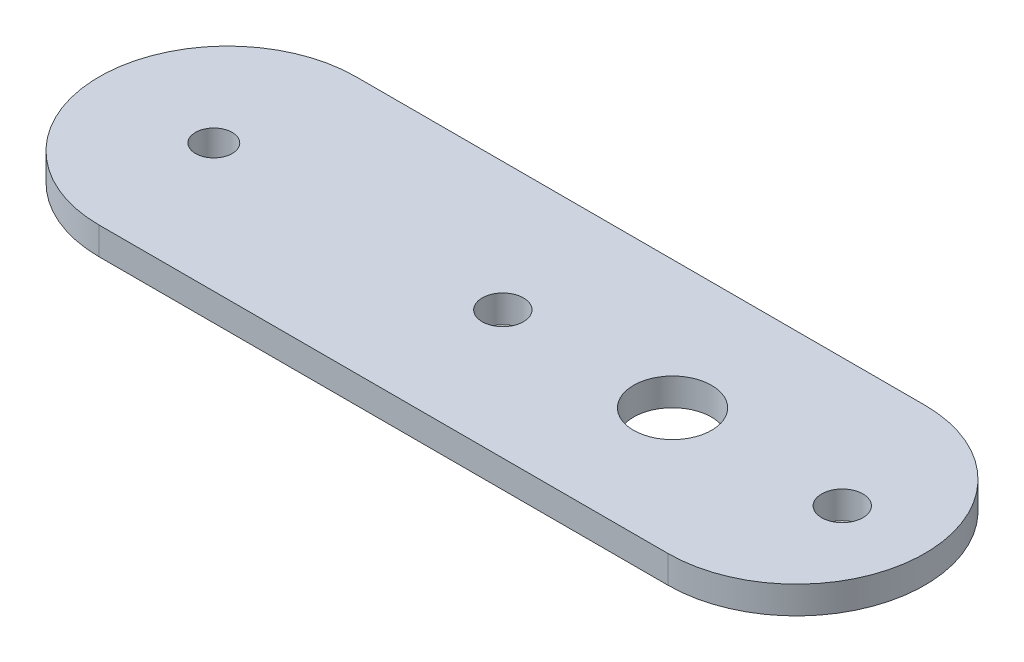
ISO-10303-21;
HEADER;
FILE_DESCRIPTION(('STEP AP214'),'2;1');
FILE_NAME('part.step','',(''),(''),'','','');
FILE_SCHEMA(('AUTOMOTIVE_DESIGN { 1 0 10303 214 1 1 1 1 }'));
ENDSEC;
DATA;
#1=APPLICATION_CONTEXT('core data for automotive mechanical design processes');
#2=APPLICATION_PROTOCOL_DEFINITION('international standard','automotive_design',2000,#1);
#3=PRODUCT_CONTEXT('',#1,'mechanical');
#4=PRODUCT('Part','Part','',(#3));
#5=PRODUCT_RELATED_PRODUCT_CATEGORY('part','',(#4));
#6=PRODUCT_DEFINITION_FORMATION('','',#4);
#7=PRODUCT_DEFINITION_CONTEXT('part definition',#1,'design');
#8=PRODUCT_DEFINITION('design','',#6,#7);
#9=PRODUCT_DEFINITION_SHAPE('','',#8);
#10=(LENGTH_UNIT() NAMED_UNIT(*) SI_UNIT(.MILLI.,.METRE.));
#11=(NAMED_UNIT(*) PLANE_ANGLE_UNIT() SI_UNIT($,.RADIAN.));
#12=(NAMED_UNIT(*) SI_UNIT($,.STERADIAN.) SOLID_ANGLE_UNIT());
#13=UNCERTAINTY_MEASURE_WITH_UNIT(LENGTH_MEASURE(1.E-05),#10,'distance_accuracy_value','');
#14=(GEOMETRIC_REPRESENTATION_CONTEXT(3) GLOBAL_UNCERTAINTY_ASSIGNED_CONTEXT((#13)) GLOBAL_UNIT_ASSIGNED_CONTEXT((#10,
#11,#12)) REPRESENTATION_CONTEXT('',''));
#15=CARTESIAN_POINT('',(0.,0.,0.));
#16=DIRECTION('',(0.,0.,1.));
#17=DIRECTION('',(1.,0.,0.));
#18=AXIS2_PLACEMENT_3D('',#15,#16,#17);
#19=CARTESIAN_POINT('',(31.,3.,0.));
#20=DIRECTION('',(0.,-1.,0.));
#21=DIRECTION('',(0.,0.,-1.));
#22=AXIS2_PLACEMENT_3D('',#19,#20,#21);
#23=CYLINDRICAL_SURFACE('',#22,14.);
#24=DIRECTION('',(0.,-1.,0.));
#25=VECTOR('',#24,1.);
#26=CARTESIAN_POINT('',(31.,3.,-14.));
#27=LINE('',#26,#25);
#28=CARTESIAN_POINT('',(30.9999999999999,3.,-14.));
#29=VERTEX_POINT('',#28);
#30=CARTESIAN_POINT('',(30.9999999999999,0.,-14.));
#31=VERTEX_POINT('',#30);
#32=EDGE_CURVE('E80',#29,#31,#27,.T.);
#33=ORIENTED_EDGE('',*,*,#32,.F.);
#34=CARTESIAN_POINT('',(31.,3.,0.));
#35=DIRECTION('',(0.,1.,0.));
#36=DIRECTION('',(0.,0.,1.));
#37=AXIS2_PLACEMENT_3D('',#34,#35,#36);
#38=CIRCLE('',#37,14.);
#39=CARTESIAN_POINT('',(30.9999999999999,3.,14.));
#40=VERTEX_POINT('',#39);
#41=EDGE_CURVE('E40',#40,#29,#38,.T.);
#42=ORIENTED_EDGE('',*,*,#41,.F.);
#43=DIRECTION('',(0.,-1.,0.));
#44=VECTOR('',#43,1.);
#45=CARTESIAN_POINT('',(31.,3.,14.));
#46=LINE('',#45,#44);
#47=CARTESIAN_POINT('',(30.9999999999999,0.,14.));
#48=VERTEX_POINT('',#47);
#49=EDGE_CURVE('E104',#48,#40,#46,.F.);
#50=ORIENTED_EDGE('',*,*,#49,.F.);
#51=CARTESIAN_POINT('',(31.,0.,0.));
#52=DIRECTION('',(0.,1.,0.));
#53=DIRECTION('',(0.,0.,1.));
#54=AXIS2_PLACEMENT_3D('',#51,#52,#53);
#55=CIRCLE('',#54,14.);
#56=EDGE_CURVE('E11',#31,#48,#55,.F.);
#57=ORIENTED_EDGE('',*,*,#56,.F.);
#58=EDGE_LOOP('',(#33,#42,#50,#57));
#59=FACE_BOUND('',#58,.T.);
#60=ADVANCED_FACE('F33',(#59),#23,.T.);
#61=CARTESIAN_POINT('',(-31.,3.,0.));
#62=DIRECTION('',(0.,-1.,0.));
#63=DIRECTION('',(0.,0.,-1.));
#64=AXIS2_PLACEMENT_3D('',#61,#62,#63);
#65=CYLINDRICAL_SURFACE('',#64,14.);
#66=DIRECTION('',(0.,-1.,0.));
#67=VECTOR('',#66,1.);
#68=CARTESIAN_POINT('',(-31.,3.,14.));
#69=LINE('',#68,#67);
#70=CARTESIAN_POINT('',(-31.,3.,14.));
#71=VERTEX_POINT('',#70);
#72=CARTESIAN_POINT('',(-31.,0.,14.));
#73=VERTEX_POINT('',#72);
#74=EDGE_CURVE('E76',#71,#73,#69,.T.);
#75=ORIENTED_EDGE('',*,*,#74,.F.);
#76=CARTESIAN_POINT('',(-31.,3.,0.));
#77=DIRECTION('',(0.,1.,0.));
#78=DIRECTION('',(0.,0.,1.));
#79=AXIS2_PLACEMENT_3D('',#76,#77,#78);
#80=CIRCLE('',#79,14.);
#81=CARTESIAN_POINT('',(-31.,3.,-14.));
#82=VERTEX_POINT('',#81);
#83=EDGE_CURVE('E81',#82,#71,#80,.T.);
#84=ORIENTED_EDGE('',*,*,#83,.F.);
#85=DIRECTION('',(0.,-1.,0.));
#86=VECTOR('',#85,1.);
#87=CARTESIAN_POINT('',(-31.,3.,-14.));
#88=LINE('',#87,#86);
#89=CARTESIAN_POINT('',(-31.,0.,-14.));
#90=VERTEX_POINT('',#89);
#91=EDGE_CURVE('E79',#90,#82,#88,.F.);
#92=ORIENTED_EDGE('',*,*,#91,.F.);
#93=CARTESIAN_POINT('',(-31.,0.,0.));
#94=DIRECTION('',(0.,1.,0.));
#95=DIRECTION('',(0.,0.,1.));
#96=AXIS2_PLACEMENT_3D('',#93,#94,#95);
#97=CIRCLE('',#96,14.);
#98=EDGE_CURVE('E72',#73,#90,#97,.F.);
#99=ORIENTED_EDGE('',*,*,#98,.F.);
#100=EDGE_LOOP('',(#75,#84,#92,#99));
#101=FACE_BOUND('',#100,.T.);
#102=ADVANCED_FACE('F74',(#101),#65,.T.);
#103=CARTESIAN_POINT('',(0.,3.,0.));
#104=DIRECTION('',(0.,1.,0.));
#105=DIRECTION('',(0.,0.,1.));
#106=AXIS2_PLACEMENT_3D('',#103,#104,#105);
#107=PLANE('',#106);
#108=CARTESIAN_POINT('',(-1.00000000000002,3.,0.));
#109=DIRECTION('',(0.,1.,0.));
#110=DIRECTION('',(0.,0.,1.));
#111=AXIS2_PLACEMENT_3D('',#108,#109,#110);
#112=CIRCLE('',#111,2.25);
#113=CARTESIAN_POINT('',(-1.00000000000002,3.,2.25));
#114=VERTEX_POINT('',#113);
#115=EDGE_CURVE('E153',#114,#114,#112,.T.);
#116=ORIENTED_EDGE('',*,*,#115,.F.);
#117=EDGE_LOOP('',(#116));
#118=FACE_BOUND('',#117,.T.);
#119=CARTESIAN_POINT('',(36.,3.,0.));
#120=DIRECTION('',(0.,1.,0.));
#121=DIRECTION('',(0.,0.,1.));
#122=AXIS2_PLACEMENT_3D('',#119,#120,#121);
#123=CIRCLE('',#122,2.25);
#124=CARTESIAN_POINT('',(36.,3.,2.25));
#125=VERTEX_POINT('',#124);
#126=EDGE_CURVE('E157',#125,#125,#123,.T.);
#127=ORIENTED_EDGE('',*,*,#126,.F.);
#128=EDGE_LOOP('',(#127));
#129=FACE_BOUND('',#128,.T.);
#130=CARTESIAN_POINT('',(17.5,3.,0.));
#131=DIRECTION('',(0.,1.,0.));
#132=DIRECTION('',(0.,0.,1.));
#133=AXIS2_PLACEMENT_3D('',#130,#131,#132);
#134=CIRCLE('',#133,4.25000000000001);
#135=CARTESIAN_POINT('',(17.5,3.,4.25000000000001));
#136=VERTEX_POINT('',#135);
#137=EDGE_CURVE('E96',#136,#136,#134,.T.);
#138=ORIENTED_EDGE('',*,*,#137,.F.);
#139=EDGE_LOOP('',(#138));
#140=FACE_BOUND('',#139,.T.);
#141=DIRECTION('',(1.,0.,0.));
#142=VECTOR('',#141,1.);
#143=CARTESIAN_POINT('',(-45.,3.,14.));
#144=LINE('',#143,#142);
#145=EDGE_CURVE('E88',#71,#40,#144,.T.);
#146=ORIENTED_EDGE('',*,*,#145,.T.);
#147=ORIENTED_EDGE('',*,*,#41,.T.);
#148=DIRECTION('',(-1.,0.,0.));
#149=VECTOR('',#148,1.);
#150=CARTESIAN_POINT('',(-45.,3.,-14.));
#151=LINE('',#150,#149);
#152=EDGE_CURVE('E92',#29,#82,#151,.T.);
#153=ORIENTED_EDGE('',*,*,#152,.T.);
#154=ORIENTED_EDGE('',*,*,#83,.T.);
#155=EDGE_LOOP('',(#146,#147,#153,#154));
#156=FACE_BOUND('',#155,.T.);
#157=CARTESIAN_POINT('',(-32.5,3.,0.));
#158=DIRECTION('',(0.,1.,0.));
#159=DIRECTION('',(0.,0.,1.));
#160=AXIS2_PLACEMENT_3D('',#157,#158,#159);
#161=CIRCLE('',#160,2.);
#162=CARTESIAN_POINT('',(-32.5,3.,2.));
#163=VERTEX_POINT('',#162);
#164=EDGE_CURVE('E167',#163,#163,#161,.T.);
#165=ORIENTED_EDGE('',*,*,#164,.F.);
#166=EDGE_LOOP('',(#165));
#167=FACE_BOUND('',#166,.T.);
#168=ADVANCED_FACE('F106',(#118,#129,#140,#156,#167),#107,.T.);
#169=CARTESIAN_POINT('',(0.,0.,0.));
#170=DIRECTION('',(0.,1.,0.));
#171=DIRECTION('',(0.,0.,1.));
#172=AXIS2_PLACEMENT_3D('',#169,#170,#171);
#173=PLANE('',#172);
#174=CARTESIAN_POINT('',(-1.00000000000002,0.,0.));
#175=DIRECTION('',(0.,1.,0.));
#176=DIRECTION('',(0.,0.,1.));
#177=AXIS2_PLACEMENT_3D('',#174,#175,#176);
#178=CIRCLE('',#177,2.25);
#179=CARTESIAN_POINT('',(-1.00000000000002,0.,2.25));
#180=VERTEX_POINT('',#179);
#181=EDGE_CURVE('E156',#180,#180,#178,.F.);
#182=ORIENTED_EDGE('',*,*,#181,.F.);
#183=EDGE_LOOP('',(#182));
#184=FACE_BOUND('',#183,.T.);
#185=CARTESIAN_POINT('',(36.,0.,0.));
#186=DIRECTION('',(0.,1.,0.));
#187=DIRECTION('',(0.,0.,1.));
#188=AXIS2_PLACEMENT_3D('',#185,#186,#187);
#189=CIRCLE('',#188,2.25);
#190=CARTESIAN_POINT('',(36.,0.,2.25));
#191=VERTEX_POINT('',#190);
#192=EDGE_CURVE('E160',#191,#191,#189,.F.);
#193=ORIENTED_EDGE('',*,*,#192,.F.);
#194=EDGE_LOOP('',(#193));
#195=FACE_BOUND('',#194,.T.);
#196=CARTESIAN_POINT('',(17.5,0.,0.));
#197=DIRECTION('',(0.,1.,0.));
#198=DIRECTION('',(0.,0.,1.));
#199=AXIS2_PLACEMENT_3D('',#196,#197,#198);
#200=CIRCLE('',#199,4.25000000000001);
#201=CARTESIAN_POINT('',(17.5,0.,4.25000000000001));
#202=VERTEX_POINT('',#201);
#203=EDGE_CURVE('E170',#202,#202,#200,.T.);
#204=ORIENTED_EDGE('',*,*,#203,.T.);
#205=EDGE_LOOP('',(#204));
#206=FACE_BOUND('',#205,.T.);
#207=DIRECTION('',(-1.,0.,0.));
#208=VECTOR('',#207,1.);
#209=CARTESIAN_POINT('',(-45.,0.,-14.));
#210=LINE('',#209,#208);
#211=EDGE_CURVE('E93',#31,#90,#210,.T.);
#212=ORIENTED_EDGE('',*,*,#211,.F.);
#213=ORIENTED_EDGE('',*,*,#56,.T.);
#214=DIRECTION('',(1.,0.,0.));
#215=VECTOR('',#214,1.);
#216=CARTESIAN_POINT('',(-45.,0.,14.));
#217=LINE('',#216,#215);
#218=EDGE_CURVE('E86',#73,#48,#217,.T.);
#219=ORIENTED_EDGE('',*,*,#218,.F.);
#220=ORIENTED_EDGE('',*,*,#98,.T.);
#221=EDGE_LOOP('',(#212,#213,#219,#220));
#222=FACE_BOUND('',#221,.T.);
#223=CARTESIAN_POINT('',(-32.5,0.,0.));
#224=DIRECTION('',(0.,1.,0.));
#225=DIRECTION('',(0.,0.,1.));
#226=AXIS2_PLACEMENT_3D('',#223,#224,#225);
#227=CIRCLE('',#226,2.);
#228=CARTESIAN_POINT('',(-32.5,0.,2.));
#229=VERTEX_POINT('',#228);
#230=EDGE_CURVE('E166',#229,#229,#227,.T.);
#231=ORIENTED_EDGE('',*,*,#230,.T.);
#232=EDGE_LOOP('',(#231));
#233=FACE_BOUND('',#232,.T.);
#234=ADVANCED_FACE('F90',(#184,#195,#206,#222,#233),#173,.F.);
#235=CARTESIAN_POINT('',(-45.,3.,-14.));
#236=DIRECTION('',(0.,0.,1.));
#237=DIRECTION('',(1.,0.,0.));
#238=AXIS2_PLACEMENT_3D('',#235,#236,#237);
#239=PLANE('',#238);
#240=ORIENTED_EDGE('',*,*,#152,.F.);
#241=ORIENTED_EDGE('',*,*,#32,.T.);
#242=ORIENTED_EDGE('',*,*,#211,.T.);
#243=ORIENTED_EDGE('',*,*,#91,.T.);
#244=EDGE_LOOP('',(#240,#241,#242,#243));
#245=FACE_BOUND('',#244,.T.);
#246=ADVANCED_FACE('F110',(#245),#239,.F.);
#247=CARTESIAN_POINT('',(-45.,3.,14.));
#248=DIRECTION('',(0.,0.,-1.));
#249=DIRECTION('',(-1.,0.,0.));
#250=AXIS2_PLACEMENT_3D('',#247,#248,#249);
#251=PLANE('',#250);
#252=ORIENTED_EDGE('',*,*,#218,.T.);
#253=ORIENTED_EDGE('',*,*,#49,.T.);
#254=ORIENTED_EDGE('',*,*,#145,.F.);
#255=ORIENTED_EDGE('',*,*,#74,.T.);
#256=EDGE_LOOP('',(#252,#253,#254,#255));
#257=FACE_BOUND('',#256,.T.);
#258=ADVANCED_FACE('F85',(#257),#251,.F.);
#259=CARTESIAN_POINT('',(17.5,3.,0.));
#260=DIRECTION('',(0.,-1.,0.));
#261=DIRECTION('',(0.,0.,-1.));
#262=AXIS2_PLACEMENT_3D('',#259,#260,#261);
#263=CYLINDRICAL_SURFACE('',#262,4.25000000000001);
#264=ORIENTED_EDGE('',*,*,#137,.T.);
#265=EDGE_LOOP('',(#264));
#266=FACE_BOUND('',#265,.T.);
#267=ORIENTED_EDGE('',*,*,#203,.F.);
#268=EDGE_LOOP('',(#267));
#269=FACE_BOUND('',#268,.T.);
#270=ADVANCED_FACE('F117',(#266,#269),#263,.F.);
#271=CARTESIAN_POINT('',(-32.5,3.,0.));
#272=DIRECTION('',(0.,-1.,0.));
#273=DIRECTION('',(0.,0.,-1.));
#274=AXIS2_PLACEMENT_3D('',#271,#272,#273);
#275=CYLINDRICAL_SURFACE('',#274,2.);
#276=ORIENTED_EDGE('',*,*,#164,.T.);
#277=EDGE_LOOP('',(#276));
#278=FACE_BOUND('',#277,.T.);
#279=ORIENTED_EDGE('',*,*,#230,.F.);
#280=EDGE_LOOP('',(#279));
#281=FACE_BOUND('',#280,.T.);
#282=ADVANCED_FACE('F137',(#278,#281),#275,.F.);
#283=CARTESIAN_POINT('',(36.,-0.00100000000000013,0.));
#284=DIRECTION('',(0.,1.,0.));
#285=DIRECTION('',(0.,0.,1.));
#286=AXIS2_PLACEMENT_3D('',#283,#284,#285);
#287=CYLINDRICAL_SURFACE('',#286,2.25);
#288=CARTESIAN_POINT('',(36.,3.,2.25));
#289=CARTESIAN_POINT('',(36.,2.96875,2.25));
#290=CARTESIAN_POINT('',(36.,2.9375,2.25));
#291=CARTESIAN_POINT('',(36.,2.875,2.25));
#292=CARTESIAN_POINT('',(36.,2.84375,2.25));
#293=CARTESIAN_POINT('',(36.,2.78125,2.25));
#294=CARTESIAN_POINT('',(36.,2.75,2.25));
#295=CARTESIAN_POINT('',(36.,2.6875,2.25));
#296=CARTESIAN_POINT('',(36.,2.65625,2.25));
#297=CARTESIAN_POINT('',(36.,2.59375,2.25));
#298=CARTESIAN_POINT('',(36.,2.5625,2.25));
#299=CARTESIAN_POINT('',(36.,2.5,2.25));
#300=CARTESIAN_POINT('',(36.,2.46875,2.25));
#301=CARTESIAN_POINT('',(36.,2.40625,2.25));
#302=CARTESIAN_POINT('',(36.,2.375,2.25));
#303=CARTESIAN_POINT('',(36.,2.3125,2.25));
#304=CARTESIAN_POINT('',(36.,2.28125,2.25));
#305=CARTESIAN_POINT('',(36.,2.21875,2.25));
#306=CARTESIAN_POINT('',(36.,2.1875,2.25));
#307=CARTESIAN_POINT('',(36.,2.125,2.25));
#308=CARTESIAN_POINT('',(36.,2.09375,2.25));
#309=CARTESIAN_POINT('',(36.,2.03125,2.25));
#310=CARTESIAN_POINT('',(36.,2.,2.25));
#311=CARTESIAN_POINT('',(36.,1.9375,2.25));
#312=CARTESIAN_POINT('',(36.,1.90625,2.25));
#313=CARTESIAN_POINT('',(36.,1.84375,2.25));
#314=CARTESIAN_POINT('',(36.,1.8125,2.25));
#315=CARTESIAN_POINT('',(36.,1.75,2.25));
#316=CARTESIAN_POINT('',(36.,1.71875,2.25));
#317=CARTESIAN_POINT('',(36.,1.65625,2.25));
#318=CARTESIAN_POINT('',(36.,1.625,2.25));
#319=CARTESIAN_POINT('',(36.,1.5625,2.25));
#320=CARTESIAN_POINT('',(36.,1.53125,2.25));
#321=CARTESIAN_POINT('',(36.,1.46875,2.25));
#322=CARTESIAN_POINT('',(36.,1.4375,2.25));
#323=CARTESIAN_POINT('',(36.,1.375,2.25));
#324=CARTESIAN_POINT('',(36.,1.34375,2.25));
#325=CARTESIAN_POINT('',(36.,1.28125,2.25));
#326=CARTESIAN_POINT('',(36.,1.25,2.25));
#327=CARTESIAN_POINT('',(36.,1.1875,2.25));
#328=CARTESIAN_POINT('',(36.,1.15625,2.25));
#329=CARTESIAN_POINT('',(36.,1.09375,2.25));
#330=CARTESIAN_POINT('',(36.,1.0625,2.25));
#331=CARTESIAN_POINT('',(36.,1.,2.25));
#332=CARTESIAN_POINT('',(36.,0.96875,2.25));
#333=CARTESIAN_POINT('',(36.,0.90625,2.25));
#334=CARTESIAN_POINT('',(36.,0.875,2.25));
#335=CARTESIAN_POINT('',(36.,0.8125,2.25));
#336=CARTESIAN_POINT('',(36.,0.78125,2.25));
#337=CARTESIAN_POINT('',(36.,0.71875,2.25));
#338=CARTESIAN_POINT('',(36.,0.6875,2.25));
#339=CARTESIAN_POINT('',(36.,0.625,2.25));
#340=CARTESIAN_POINT('',(36.,0.59375,2.25));
#341=CARTESIAN_POINT('',(36.,0.53125,2.25));
#342=CARTESIAN_POINT('',(36.,0.5,2.25));
#343=CARTESIAN_POINT('',(36.,0.4375,2.25));
#344=CARTESIAN_POINT('',(36.,0.40625,2.25));
#345=CARTESIAN_POINT('',(36.,0.34375,2.25));
#346=CARTESIAN_POINT('',(36.,0.3125,2.25));
#347=CARTESIAN_POINT('',(36.,0.25,2.25));
#348=CARTESIAN_POINT('',(36.,0.21875,2.25));
#349=CARTESIAN_POINT('',(36.,0.15625,2.25));
#350=CARTESIAN_POINT('',(36.,0.125,2.25));
#351=CARTESIAN_POINT('',(36.,0.0625000000000001,2.25));
#352=CARTESIAN_POINT('',(36.,0.0312500000000001,2.25));
#353=CARTESIAN_POINT('',(36.,0.,2.25));
#354=B_SPLINE_CURVE_WITH_KNOTS('',3,(#288,#289,#290,#291,#292,#293,#294,#295,#296,#297,#298,
#299,#300,#301,#302,#303,#304,#305,#306,#307,#308,#309,#310,#311,#312,#313,#314,#315,#316,#317,
#318,#319,#320,#321,#322,#323,#324,#325,#326,#327,#328,#329,#330,#331,#332,#333,#334,#335,#336,
#337,#338,#339,#340,#341,#342,#343,#344,#345,#346,#347,#348,#349,#350,#351,#352,#353),
.UNSPECIFIED.,.F.,.F.,(4,2,2,2,2,2,2,2,2,2,2,2,2,2,2,2,2,2,2,2,2,2,2,2,2,2,2,2,2,2,2,2,4),(0.,
0.0937500000000001,0.1875,0.28125,0.375,0.46875,0.5625,0.65625,0.75,0.84375,0.9375,1.03125,
1.125,1.21875,1.3125,1.40625,1.5,1.59375,1.6875,1.78125,1.875,1.96875,2.0625,2.15625,2.25,
2.34375,2.4375,2.53125,2.625,2.71875,2.8125,2.90625,3.),.UNSPECIFIED.);
#355=EDGE_CURVE('BSEAM141',#125,#191,#354,.T.);
#356=ORIENTED_EDGE('',*,*,#126,.T.);
#357=ORIENTED_EDGE('',*,*,#192,.T.);
#358=ORIENTED_EDGE('',*,*,#355,.T.);
#359=ORIENTED_EDGE('',*,*,#355,.F.);
#360=EDGE_LOOP('',(#356,#358,#357,#359));
#361=FACE_BOUND('',#360,.T.);
#362=ADVANCED_FACE('F141',(#361),#287,.F.);
#363=CARTESIAN_POINT('',(-1.00000000000002,-0.00100000000000013,0.));
#364=DIRECTION('',(0.,1.,0.));
#365=DIRECTION('',(0.,0.,1.));
#366=AXIS2_PLACEMENT_3D('',#363,#364,#365);
#367=CYLINDRICAL_SURFACE('',#366,2.25);
#368=CARTESIAN_POINT('',(-1.00000000000002,3.,2.25));
#369=CARTESIAN_POINT('',(-1.00000000000002,2.96875,2.25));
#370=CARTESIAN_POINT('',(-1.00000000000002,2.9375,2.25));
#371=CARTESIAN_POINT('',(-1.00000000000002,2.875,2.25));
#372=CARTESIAN_POINT('',(-1.00000000000002,2.84375,2.25));
#373=CARTESIAN_POINT('',(-1.00000000000002,2.78125,2.25));
#374=CARTESIAN_POINT('',(-1.00000000000002,2.75,2.25));
#375=CARTESIAN_POINT('',(-1.00000000000002,2.6875,2.25));
#376=CARTESIAN_POINT('',(-1.00000000000002,2.65625,2.25));
#377=CARTESIAN_POINT('',(-1.00000000000002,2.59375,2.25));
#378=CARTESIAN_POINT('',(-1.00000000000002,2.5625,2.25));
#379=CARTESIAN_POINT('',(-1.00000000000002,2.5,2.25));
#380=CARTESIAN_POINT('',(-1.00000000000002,2.46875,2.25));
#381=CARTESIAN_POINT('',(-1.00000000000002,2.40625,2.25));
#382=CARTESIAN_POINT('',(-1.00000000000002,2.375,2.25));
#383=CARTESIAN_POINT('',(-1.00000000000002,2.3125,2.25));
#384=CARTESIAN_POINT('',(-1.00000000000002,2.28125,2.25));
#385=CARTESIAN_POINT('',(-1.00000000000002,2.21875,2.25));
#386=CARTESIAN_POINT('',(-1.00000000000002,2.1875,2.25));
#387=CARTESIAN_POINT('',(-1.00000000000002,2.125,2.25));
#388=CARTESIAN_POINT('',(-1.00000000000002,2.09375,2.25));
#389=CARTESIAN_POINT('',(-1.00000000000002,2.03125,2.25));
#390=CARTESIAN_POINT('',(-1.00000000000002,2.,2.25));
#391=CARTESIAN_POINT('',(-1.00000000000002,1.9375,2.25));
#392=CARTESIAN_POINT('',(-1.00000000000002,1.90625,2.25));
#393=CARTESIAN_POINT('',(-1.00000000000002,1.84375,2.25));
#394=CARTESIAN_POINT('',(-1.00000000000002,1.8125,2.25));
#395=CARTESIAN_POINT('',(-1.00000000000002,1.75,2.25));
#396=CARTESIAN_POINT('',(-1.00000000000002,1.71875,2.25));
#397=CARTESIAN_POINT('',(-1.00000000000002,1.65625,2.25));
#398=CARTESIAN_POINT('',(-1.00000000000002,1.625,2.25));
#399=CARTESIAN_POINT('',(-1.00000000000002,1.5625,2.25));
#400=CARTESIAN_POINT('',(-1.00000000000002,1.53125,2.25));
#401=CARTESIAN_POINT('',(-1.00000000000002,1.46875,2.25));
#402=CARTESIAN_POINT('',(-1.00000000000002,1.4375,2.25));
#403=CARTESIAN_POINT('',(-1.00000000000002,1.375,2.25));
#404=CARTESIAN_POINT('',(-1.00000000000002,1.34375,2.25));
#405=CARTESIAN_POINT('',(-1.00000000000002,1.28125,2.25));
#406=CARTESIAN_POINT('',(-1.00000000000002,1.25,2.25));
#407=CARTESIAN_POINT('',(-1.00000000000002,1.1875,2.25));
#408=CARTESIAN_POINT('',(-1.00000000000002,1.15625,2.25));
#409=CARTESIAN_POINT('',(-1.00000000000002,1.09375,2.25));
#410=CARTESIAN_POINT('',(-1.00000000000002,1.0625,2.25));
#411=CARTESIAN_POINT('',(-1.00000000000002,1.,2.25));
#412=CARTESIAN_POINT('',(-1.00000000000002,0.96875,2.25));
#413=CARTESIAN_POINT('',(-1.00000000000002,0.90625,2.25));
#414=CARTESIAN_POINT('',(-1.00000000000002,0.875,2.25));
#415=CARTESIAN_POINT('',(-1.00000000000002,0.8125,2.25));
#416=CARTESIAN_POINT('',(-1.00000000000002,0.78125,2.25));
#417=CARTESIAN_POINT('',(-1.00000000000002,0.71875,2.25));
#418=CARTESIAN_POINT('',(-1.00000000000002,0.6875,2.25));
#419=CARTESIAN_POINT('',(-1.00000000000002,0.625,2.25));
#420=CARTESIAN_POINT('',(-1.00000000000002,0.59375,2.25));
#421=CARTESIAN_POINT('',(-1.00000000000002,0.53125,2.25));
#422=CARTESIAN_POINT('',(-1.00000000000002,0.5,2.25));
#423=CARTESIAN_POINT('',(-1.00000000000002,0.4375,2.25));
#424=CARTESIAN_POINT('',(-1.00000000000002,0.40625,2.25));
#425=CARTESIAN_POINT('',(-1.00000000000002,0.34375,2.25));
#426=CARTESIAN_POINT('',(-1.00000000000002,0.3125,2.25));
#427=CARTESIAN_POINT('',(-1.00000000000002,0.25,2.25));
#428=CARTESIAN_POINT('',(-1.00000000000002,0.21875,2.25));
#429=CARTESIAN_POINT('',(-1.00000000000002,0.15625,2.25));
#430=CARTESIAN_POINT('',(-1.00000000000002,0.125,2.25));
#431=CARTESIAN_POINT('',(-1.00000000000002,0.0625000000000001,2.25));
#432=CARTESIAN_POINT('',(-1.00000000000002,0.0312500000000001,2.25));
#433=CARTESIAN_POINT('',(-1.00000000000002,0.,2.25));
#434=B_SPLINE_CURVE_WITH_KNOTS('',3,(#368,#369,#370,#371,#372,#373,#374,#375,#376,#377,#378,
#379,#380,#381,#382,#383,#384,#385,#386,#387,#388,#389,#390,#391,#392,#393,#394,#395,#396,#397,
#398,#399,#400,#401,#402,#403,#404,#405,#406,#407,#408,#409,#410,#411,#412,#413,#414,#415,#416,
#417,#418,#419,#420,#421,#422,#423,#424,#425,#426,#427,#428,#429,#430,#431,#432,#433),
.UNSPECIFIED.,.F.,.F.,(4,2,2,2,2,2,2,2,2,2,2,2,2,2,2,2,2,2,2,2,2,2,2,2,2,2,2,2,2,2,2,2,4),(0.,
0.0937500000000001,0.1875,0.28125,0.375,0.46875,0.5625,0.65625,0.75,0.84375,0.9375,1.03125,
1.125,1.21875,1.3125,1.40625,1.5,1.59375,1.6875,1.78125,1.875,1.96875,2.0625,2.15625,2.25,
2.34375,2.4375,2.53125,2.625,2.71875,2.8125,2.90625,3.),.UNSPECIFIED.);
#435=EDGE_CURVE('BSEAM145',#114,#180,#434,.T.);
#436=ORIENTED_EDGE('',*,*,#115,.T.);
#437=ORIENTED_EDGE('',*,*,#181,.T.);
#438=ORIENTED_EDGE('',*,*,#435,.T.);
#439=ORIENTED_EDGE('',*,*,#435,.F.);
#440=EDGE_LOOP('',(#436,#438,#437,#439));
#441=FACE_BOUND('',#440,.T.);
#442=ADVANCED_FACE('F145',(#441),#367,.F.);
#443=CLOSED_SHELL('',(#60,#102,#168,#234,#246,#258,#270,#282,#362,#442));
#444=MANIFOLD_SOLID_BREP('B2',#443);
#445=ADVANCED_BREP_SHAPE_REPRESENTATION('',(#18,#444),#14);
#446=SHAPE_DEFINITION_REPRESENTATION(#9,#445);
ENDSEC;
END-ISO-10303-21;
